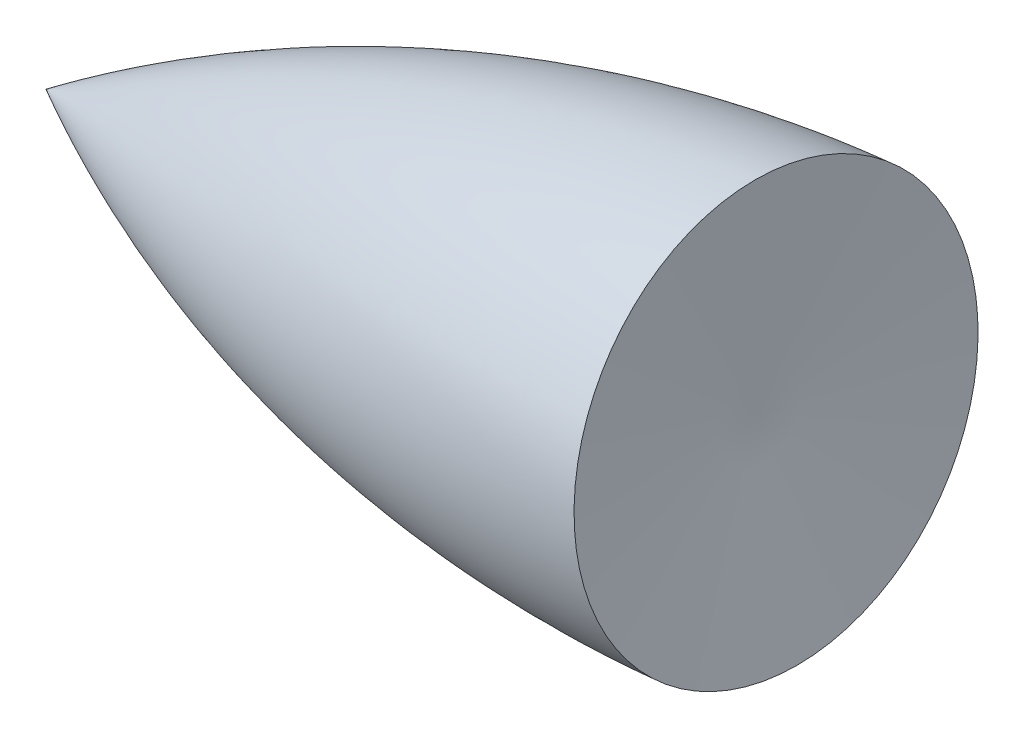
ISO-10303-21;
HEADER;
FILE_DESCRIPTION(('STEP AP214'),'2;1');
FILE_NAME('part.step','',(''),(''),'','','');
FILE_SCHEMA(('AUTOMOTIVE_DESIGN { 1 0 10303 214 1 1 1 1 }'));
ENDSEC;
DATA;
#1=APPLICATION_CONTEXT('core data for automotive mechanical design processes');
#2=APPLICATION_PROTOCOL_DEFINITION('international standard','automotive_design',2000,#1);
#3=PRODUCT_CONTEXT('',#1,'mechanical');
#4=PRODUCT('Part','Part','',(#3));
#5=PRODUCT_RELATED_PRODUCT_CATEGORY('part','',(#4));
#6=PRODUCT_DEFINITION_FORMATION('','',#4);
#7=PRODUCT_DEFINITION_CONTEXT('part definition',#1,'design');
#8=PRODUCT_DEFINITION('design','',#6,#7);
#9=PRODUCT_DEFINITION_SHAPE('','',#8);
#10=(LENGTH_UNIT() NAMED_UNIT(*) SI_UNIT(.MILLI.,.METRE.));
#11=(NAMED_UNIT(*) PLANE_ANGLE_UNIT() SI_UNIT($,.RADIAN.));
#12=(NAMED_UNIT(*) SI_UNIT($,.STERADIAN.) SOLID_ANGLE_UNIT());
#13=UNCERTAINTY_MEASURE_WITH_UNIT(LENGTH_MEASURE(1.E-05),#10,'distance_accuracy_value','');
#14=(GEOMETRIC_REPRESENTATION_CONTEXT(3) GLOBAL_UNCERTAINTY_ASSIGNED_CONTEXT((#13)) GLOBAL_UNIT_ASSIGNED_CONTEXT((#10,
#11,#12)) REPRESENTATION_CONTEXT('',''));
#15=CARTESIAN_POINT('',(0.,0.,0.));
#16=DIRECTION('',(0.,0.,1.));
#17=DIRECTION('',(1.,0.,0.));
#18=AXIS2_PLACEMENT_3D('',#15,#16,#17);
#19=CARTESIAN_POINT('',(78.7503842339694,158.955902697562,0.));
#20=DIRECTION('',(0.,0.,-1.));
#21=DIRECTION('',(0.103977711543292,-0.994579627532265,0.));
#22=AXIS2_PLACEMENT_3D('',#19,#20,#21);
#23=CIRCLE('',#22,146.262598426374);
#24=TRIMMED_CURVE('',#23,(PARAMETER_VALUE(-0.531436177781677)),
(PARAMETER_VALUE(0.531436177781677)),.T.,.PARAMETER.);
#25=CARTESIAN_POINT('',(91.8609424178041,33.5492758187882,0.));
#26=DIRECTION('',(-0.994579627532265,-0.103977711543292,0.));
#27=AXIS1_PLACEMENT('',#25,#26);
#28=SURFACE_OF_REVOLUTION('',#24,#27);
#29=CARTESIAN_POINT('',(18.1409258663547,25.8422623190525,0.));
#30=VERTEX_POINT('',#29);
#31=VERTEX_LOOP('',#30);
#32=FACE_BOUND('',#31,.T.);
#33=CARTESIAN_POINT('',(91.4329291078023,33.5045294322224,0.));
#34=DIRECTION('',(-0.994579627532265,-0.103977711543292,0.));
#35=DIRECTION('',(0.103977711543292,-0.994579627532265,0.));
#36=AXIS2_PLACEMENT_3D('',#33,#34,#35);
#37=CIRCLE('',#36,20.1718832370625);
#38=CARTESIAN_POINT('',(93.5303553643106,13.4419853156804,0.));
#39=VERTEX_POINT('',#38);
#40=EDGE_CURVE('E11',#39,#39,#37,.T.);
#41=ORIENTED_EDGE('',*,*,#40,.T.);
#42=EDGE_LOOP('',(#41));
#43=FACE_BOUND('',#42,.T.);
#44=ADVANCED_FACE('F43',(#32,#43),#28,.T.);
#45=CARTESIAN_POINT('',(89.3355028512941,33.2852553024842,0.));
#46=DIRECTION('',(0.994579627532265,0.103977711543292,0.));
#47=DIRECTION('',(-0.103977711543292,0.994579627532265,0.));
#48=AXIS2_PLACEMENT_3D('',#45,#46,#47);
#49=CONICAL_SURFACE('',#48,0.,1.46663034100671);
#50=ORIENTED_EDGE('',*,*,#40,.F.);
#51=EDGE_LOOP('',(#50));
#52=FACE_BOUND('',#51,.T.);
#53=CARTESIAN_POINT('',(89.3355028512941,33.2852553024842,0.));
#54=VERTEX_POINT('',#53);
#55=VERTEX_LOOP('',#54);
#56=FACE_BOUND('',#55,.T.);
#57=ADVANCED_FACE('F57',(#52,#56),#49,.F.);
#58=CLOSED_SHELL('',(#44,#57));
#59=MANIFOLD_SOLID_BREP('B2',#58);
#60=ADVANCED_BREP_SHAPE_REPRESENTATION('',(#18,#59),#14);
#61=SHAPE_DEFINITION_REPRESENTATION(#9,#60);
ENDSEC;
END-ISO-10303-21;
